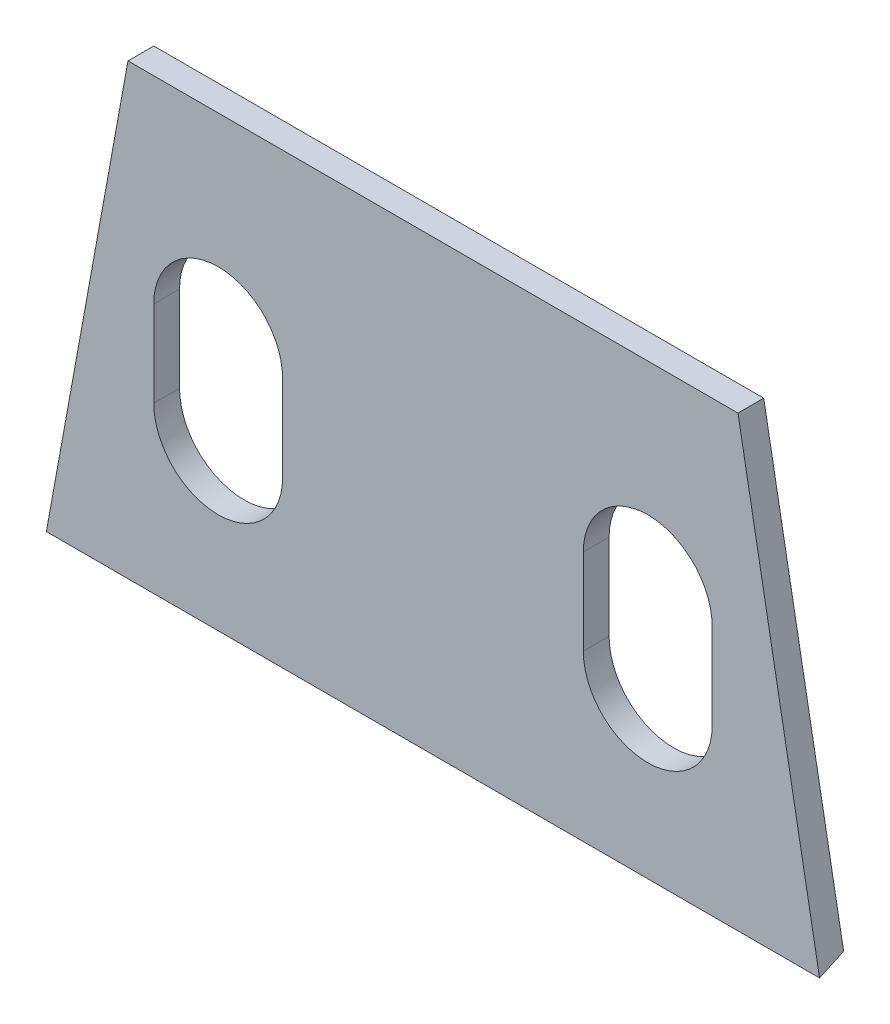
ISO-10303-21;
HEADER;
FILE_DESCRIPTION(('STEP AP214'),'2;1');
FILE_NAME('part.step','',(''),(''),'','','');
FILE_SCHEMA(('AUTOMOTIVE_DESIGN { 1 0 10303 214 1 1 1 1 }'));
ENDSEC;
DATA;
#1=APPLICATION_CONTEXT('core data for automotive mechanical design processes');
#2=APPLICATION_PROTOCOL_DEFINITION('international standard','automotive_design',2000,#1);
#3=PRODUCT_CONTEXT('',#1,'mechanical');
#4=PRODUCT('Part','Part','',(#3));
#5=PRODUCT_RELATED_PRODUCT_CATEGORY('part','',(#4));
#6=PRODUCT_DEFINITION_FORMATION('','',#4);
#7=PRODUCT_DEFINITION_CONTEXT('part definition',#1,'design');
#8=PRODUCT_DEFINITION('design','',#6,#7);
#9=PRODUCT_DEFINITION_SHAPE('','',#8);
#10=(LENGTH_UNIT() NAMED_UNIT(*) SI_UNIT(.MILLI.,.METRE.));
#11=(NAMED_UNIT(*) PLANE_ANGLE_UNIT() SI_UNIT($,.RADIAN.));
#12=(NAMED_UNIT(*) SI_UNIT($,.STERADIAN.) SOLID_ANGLE_UNIT());
#13=UNCERTAINTY_MEASURE_WITH_UNIT(LENGTH_MEASURE(1.E-05),#10,'distance_accuracy_value','');
#14=(GEOMETRIC_REPRESENTATION_CONTEXT(3) GLOBAL_UNCERTAINTY_ASSIGNED_CONTEXT((#13)) GLOBAL_UNIT_ASSIGNED_CONTEXT((#10,
#11,#12)) REPRESENTATION_CONTEXT('',''));
#15=CARTESIAN_POINT('',(0.,0.,0.));
#16=DIRECTION('',(0.,0.,1.));
#17=DIRECTION('',(1.,0.,0.));
#18=AXIS2_PLACEMENT_3D('',#15,#16,#17);
#19=CARTESIAN_POINT('',(35.5,52.2,1.5));
#20=DIRECTION('',(-0.983839740112605,-0.179051293698654,0.));
#21=DIRECTION('',(0.179051293698654,-0.983839740112605,0.));
#22=AXIS2_PLACEMENT_3D('',#19,#20,#21);
#23=PLANE('',#22);
#24=DIRECTION('',(-0.179051293698654,0.983839740112605,0.));
#25=VECTOR('',#24,1.);
#26=CARTESIAN_POINT('',(35.5,52.2,1.5));
#27=LINE('',#26,#25);
#28=CARTESIAN_POINT('',(45.,0.,1.5));
#29=VERTEX_POINT('',#28);
#30=CARTESIAN_POINT('',(35.5,52.2,1.5));
#31=VERTEX_POINT('',#30);
#32=EDGE_CURVE('E243',#29,#31,#27,.T.);
#33=ORIENTED_EDGE('',*,*,#32,.F.);
#34=DIRECTION('',(0.0621248119839871,-0.341359493217276,0.937877499530935));
#35=VECTOR('',#34,1.);
#36=CARTESIAN_POINT('',(44.6526456962359,1.90862049015652,-3.74389169901341));
#37=LINE('',#36,#35);
#38=CARTESIAN_POINT('',(44.8012806192225,1.09191070279862,-1.5));
#39=VERTEX_POINT('',#38);
#40=EDGE_CURVE('E68',#29,#39,#37,.F.);
#41=ORIENTED_EDGE('',*,*,#40,.T.);
#42=DIRECTION('',(-0.179051293698654,0.983839740112605,0.));
#43=VECTOR('',#42,1.);
#44=CARTESIAN_POINT('',(35.5,52.2,-1.5));
#45=LINE('',#44,#43);
#46=CARTESIAN_POINT('',(35.5,52.2,-1.5));
#47=VERTEX_POINT('',#46);
#48=EDGE_CURVE('E190',#39,#47,#45,.T.);
#49=ORIENTED_EDGE('',*,*,#48,.T.);
#50=DIRECTION('',(0.,0.,-1.));
#51=VECTOR('',#50,1.);
#52=CARTESIAN_POINT('',(35.5,52.2,1.5));
#53=LINE('',#52,#51);
#54=EDGE_CURVE('E274',#31,#47,#53,.T.);
#55=ORIENTED_EDGE('',*,*,#54,.F.);
#56=EDGE_LOOP('',(#33,#41,#49,#55));
#57=FACE_BOUND('',#56,.T.);
#58=ADVANCED_FACE('F44',(#57),#23,.F.);
#59=CARTESIAN_POINT('',(-35.5,52.2,1.5));
#60=DIRECTION('',(0.,-1.,0.));
#61=DIRECTION('',(0.,0.,-1.));
#62=AXIS2_PLACEMENT_3D('',#59,#60,#61);
#63=PLANE('',#62);
#64=DIRECTION('',(-1.,0.,0.));
#65=VECTOR('',#64,1.);
#66=CARTESIAN_POINT('',(-35.5,52.2,-1.5));
#67=LINE('',#66,#65);
#68=CARTESIAN_POINT('',(-35.5,52.2,-1.5));
#69=VERTEX_POINT('',#68);
#70=EDGE_CURVE('E266',#47,#69,#67,.T.);
#71=ORIENTED_EDGE('',*,*,#70,.T.);
#72=DIRECTION('',(0.,0.,-1.));
#73=VECTOR('',#72,1.);
#74=CARTESIAN_POINT('',(-35.5,52.2,1.5));
#75=LINE('',#74,#73);
#76=CARTESIAN_POINT('',(-35.5,52.2,1.5));
#77=VERTEX_POINT('',#76);
#78=EDGE_CURVE('E263',#77,#69,#75,.T.);
#79=ORIENTED_EDGE('',*,*,#78,.F.);
#80=DIRECTION('',(-1.,0.,0.));
#81=VECTOR('',#80,1.);
#82=CARTESIAN_POINT('',(-35.5,52.2,1.5));
#83=LINE('',#82,#81);
#84=EDGE_CURVE('E248',#31,#77,#83,.T.);
#85=ORIENTED_EDGE('',*,*,#84,.F.);
#86=ORIENTED_EDGE('',*,*,#54,.T.);
#87=EDGE_LOOP('',(#71,#79,#85,#86));
#88=FACE_BOUND('',#87,.T.);
#89=ADVANCED_FACE('F288',(#88),#63,.F.);
#90=CARTESIAN_POINT('',(-45.,0.,1.5));
#91=DIRECTION('',(0.983839740112605,-0.179051293698654,0.));
#92=DIRECTION('',(0.179051293698654,0.983839740112605,0.));
#93=AXIS2_PLACEMENT_3D('',#90,#91,#92);
#94=PLANE('',#93);
#95=DIRECTION('',(-0.179051293698654,-0.983839740112605,0.));
#96=VECTOR('',#95,1.);
#97=CARTESIAN_POINT('',(-45.,0.,-1.5));
#98=LINE('',#97,#96);
#99=CARTESIAN_POINT('',(-44.8012806192225,1.09191070279861,-1.5));
#100=VERTEX_POINT('',#99);
#101=EDGE_CURVE('E249',#69,#100,#98,.T.);
#102=ORIENTED_EDGE('',*,*,#101,.T.);
#103=DIRECTION('',(0.0621248119839871,0.341359493217276,-0.937877499530935));
#104=VECTOR('',#103,1.);
#105=CARTESIAN_POINT('',(-45.,0.,1.5));
#106=LINE('',#105,#104);
#107=CARTESIAN_POINT('',(-45.,0.,1.5));
#108=VERTEX_POINT('',#107);
#109=EDGE_CURVE('E12',#100,#108,#106,.F.);
#110=ORIENTED_EDGE('',*,*,#109,.T.);
#111=DIRECTION('',(-0.179051293698654,-0.983839740112605,0.));
#112=VECTOR('',#111,1.);
#113=CARTESIAN_POINT('',(-45.,0.,1.5));
#114=LINE('',#113,#112);
#115=EDGE_CURVE('E254',#77,#108,#114,.T.);
#116=ORIENTED_EDGE('',*,*,#115,.F.);
#117=ORIENTED_EDGE('',*,*,#78,.T.);
#118=EDGE_LOOP('',(#102,#110,#116,#117));
#119=FACE_BOUND('',#118,.T.);
#120=ADVANCED_FACE('F291',(#119),#94,.F.);
#121=CARTESIAN_POINT('',(0.,0.,1.5));
#122=DIRECTION('',(0.,0.,1.));
#123=DIRECTION('',(1.,0.,0.));
#124=AXIS2_PLACEMENT_3D('',#121,#122,#123);
#125=PLANE('',#124);
#126=CARTESIAN_POINT('',(-25.,29.2,1.5));
#127=DIRECTION('',(0.,0.,1.));
#128=DIRECTION('',(1.,0.,0.));
#129=AXIS2_PLACEMENT_3D('',#126,#127,#128);
#130=CIRCLE('',#129,7.49999999999997);
#131=CARTESIAN_POINT('',(-17.5,29.2,1.5));
#132=VERTEX_POINT('',#131);
#133=CARTESIAN_POINT('',(-32.5,29.2,1.5));
#134=VERTEX_POINT('',#133);
#135=EDGE_CURVE('E141',#132,#134,#130,.T.);
#136=ORIENTED_EDGE('',*,*,#135,.F.);
#137=DIRECTION('',(0.,1.,0.));
#138=VECTOR('',#137,1.);
#139=CARTESIAN_POINT('',(-17.5,29.2,1.5));
#140=LINE('',#139,#138);
#141=CARTESIAN_POINT('',(-17.5,19.2,1.5));
#142=VERTEX_POINT('',#141);
#143=EDGE_CURVE('E162',#142,#132,#140,.T.);
#144=ORIENTED_EDGE('',*,*,#143,.F.);
#145=CARTESIAN_POINT('',(-25.,19.2,1.5));
#146=DIRECTION('',(0.,0.,1.));
#147=DIRECTION('',(1.,0.,0.));
#148=AXIS2_PLACEMENT_3D('',#145,#146,#147);
#149=CIRCLE('',#148,7.49999999999998);
#150=CARTESIAN_POINT('',(-32.5,19.2,1.5));
#151=VERTEX_POINT('',#150);
#152=EDGE_CURVE('E166',#151,#142,#149,.T.);
#153=ORIENTED_EDGE('',*,*,#152,.F.);
#154=DIRECTION('',(0.,-1.,0.));
#155=VECTOR('',#154,1.);
#156=CARTESIAN_POINT('',(-32.5,29.2,1.5));
#157=LINE('',#156,#155);
#158=EDGE_CURVE('E176',#134,#151,#157,.T.);
#159=ORIENTED_EDGE('',*,*,#158,.F.);
#160=EDGE_LOOP('',(#136,#144,#153,#159));
#161=FACE_BOUND('',#160,.T.);
#162=CARTESIAN_POINT('',(25.,29.2,1.5));
#163=DIRECTION('',(0.,0.,1.));
#164=DIRECTION('',(-1.,0.,0.));
#165=AXIS2_PLACEMENT_3D('',#162,#163,#164);
#166=CIRCLE('',#165,7.49999999999997);
#167=CARTESIAN_POINT('',(32.5,29.2,1.5));
#168=VERTEX_POINT('',#167);
#169=CARTESIAN_POINT('',(17.5,29.2,1.5));
#170=VERTEX_POINT('',#169);
#171=EDGE_CURVE('E214',#168,#170,#166,.T.);
#172=ORIENTED_EDGE('',*,*,#171,.F.);
#173=DIRECTION('',(0.,1.,0.));
#174=VECTOR('',#173,1.);
#175=CARTESIAN_POINT('',(32.5,29.2,1.5));
#176=LINE('',#175,#174);
#177=CARTESIAN_POINT('',(32.5,19.2,1.5));
#178=VERTEX_POINT('',#177);
#179=EDGE_CURVE('E201',#178,#168,#176,.T.);
#180=ORIENTED_EDGE('',*,*,#179,.F.);
#181=CARTESIAN_POINT('',(25.,19.2,1.5));
#182=DIRECTION('',(0.,0.,1.));
#183=DIRECTION('',(-1.,0.,0.));
#184=AXIS2_PLACEMENT_3D('',#181,#182,#183);
#185=CIRCLE('',#184,7.49999999999997);
#186=CARTESIAN_POINT('',(17.5,19.2,1.5));
#187=VERTEX_POINT('',#186);
#188=EDGE_CURVE('E230',#187,#178,#185,.T.);
#189=ORIENTED_EDGE('',*,*,#188,.F.);
#190=DIRECTION('',(0.,-1.,0.));
#191=VECTOR('',#190,1.);
#192=CARTESIAN_POINT('',(17.5,29.2,1.5));
#193=LINE('',#192,#191);
#194=EDGE_CURVE('E218',#170,#187,#193,.T.);
#195=ORIENTED_EDGE('',*,*,#194,.F.);
#196=EDGE_LOOP('',(#172,#180,#189,#195));
#197=FACE_BOUND('',#196,.T.);
#198=ORIENTED_EDGE('',*,*,#32,.T.);
#199=ORIENTED_EDGE('',*,*,#84,.T.);
#200=ORIENTED_EDGE('',*,*,#115,.T.);
#201=DIRECTION('',(1.,0.,0.));
#202=VECTOR('',#201,1.);
#203=CARTESIAN_POINT('',(-45.,0.,1.5));
#204=LINE('',#203,#202);
#205=EDGE_CURVE('E258',#108,#29,#204,.T.);
#206=ORIENTED_EDGE('',*,*,#205,.T.);
#207=EDGE_LOOP('',(#198,#199,#200,#206));
#208=FACE_BOUND('',#207,.T.);
#209=ADVANCED_FACE('F283',(#161,#197,#208),#125,.T.);
#210=CARTESIAN_POINT('',(0.,0.,-1.5));
#211=DIRECTION('',(0.,0.,1.));
#212=DIRECTION('',(1.,0.,0.));
#213=AXIS2_PLACEMENT_3D('',#210,#211,#212);
#214=PLANE('',#213);
#215=DIRECTION('',(0.,1.,0.));
#216=VECTOR('',#215,1.);
#217=CARTESIAN_POINT('',(-17.5,29.2,-1.5));
#218=LINE('',#217,#216);
#219=CARTESIAN_POINT('',(-17.5,19.2,-1.5));
#220=VERTEX_POINT('',#219);
#221=CARTESIAN_POINT('',(-17.5,29.2,-1.5));
#222=VERTEX_POINT('',#221);
#223=EDGE_CURVE('E147',#220,#222,#218,.T.);
#224=ORIENTED_EDGE('',*,*,#223,.T.);
#225=CARTESIAN_POINT('',(-25.,29.2,-1.5));
#226=DIRECTION('',(0.,0.,1.));
#227=DIRECTION('',(1.,0.,0.));
#228=AXIS2_PLACEMENT_3D('',#225,#226,#227);
#229=CIRCLE('',#228,7.49999999999997);
#230=CARTESIAN_POINT('',(-32.5,29.2,-1.5));
#231=VERTEX_POINT('',#230);
#232=EDGE_CURVE('E138',#222,#231,#229,.T.);
#233=ORIENTED_EDGE('',*,*,#232,.T.);
#234=DIRECTION('',(0.,-1.,0.));
#235=VECTOR('',#234,1.);
#236=CARTESIAN_POINT('',(-32.5,29.2,-1.5));
#237=LINE('',#236,#235);
#238=CARTESIAN_POINT('',(-32.5,19.2,-1.5));
#239=VERTEX_POINT('',#238);
#240=EDGE_CURVE('E151',#231,#239,#237,.T.);
#241=ORIENTED_EDGE('',*,*,#240,.T.);
#242=CARTESIAN_POINT('',(-25.,19.2,-1.5));
#243=DIRECTION('',(0.,0.,1.));
#244=DIRECTION('',(1.,0.,0.));
#245=AXIS2_PLACEMENT_3D('',#242,#243,#244);
#246=CIRCLE('',#245,7.49999999999998);
#247=EDGE_CURVE('E156',#239,#220,#246,.T.);
#248=ORIENTED_EDGE('',*,*,#247,.T.);
#249=EDGE_LOOP('',(#224,#233,#241,#248));
#250=FACE_BOUND('',#249,.T.);
#251=DIRECTION('',(0.,1.,0.));
#252=VECTOR('',#251,1.);
#253=CARTESIAN_POINT('',(32.5,29.2,-1.5));
#254=LINE('',#253,#252);
#255=CARTESIAN_POINT('',(32.5,19.2,-1.5));
#256=VERTEX_POINT('',#255);
#257=CARTESIAN_POINT('',(32.5,29.2,-1.5));
#258=VERTEX_POINT('',#257);
#259=EDGE_CURVE('E209',#256,#258,#254,.T.);
#260=ORIENTED_EDGE('',*,*,#259,.T.);
#261=CARTESIAN_POINT('',(25.,29.2,-1.5));
#262=DIRECTION('',(0.,0.,1.));
#263=DIRECTION('',(-1.,0.,0.));
#264=AXIS2_PLACEMENT_3D('',#261,#262,#263);
#265=CIRCLE('',#264,7.49999999999997);
#266=CARTESIAN_POINT('',(17.5,29.2,-1.5));
#267=VERTEX_POINT('',#266);
#268=EDGE_CURVE('E196',#258,#267,#265,.T.);
#269=ORIENTED_EDGE('',*,*,#268,.T.);
#270=DIRECTION('',(0.,-1.,0.));
#271=VECTOR('',#270,1.);
#272=CARTESIAN_POINT('',(17.5,29.2,-1.5));
#273=LINE('',#272,#271);
#274=CARTESIAN_POINT('',(17.5,19.2,-1.5));
#275=VERTEX_POINT('',#274);
#276=EDGE_CURVE('E200',#267,#275,#273,.T.);
#277=ORIENTED_EDGE('',*,*,#276,.T.);
#278=CARTESIAN_POINT('',(25.,19.2,-1.5));
#279=DIRECTION('',(0.,0.,1.));
#280=DIRECTION('',(-1.,0.,0.));
#281=AXIS2_PLACEMENT_3D('',#278,#279,#280);
#282=CIRCLE('',#281,7.49999999999997);
#283=EDGE_CURVE('E205',#275,#256,#282,.T.);
#284=ORIENTED_EDGE('',*,*,#283,.T.);
#285=EDGE_LOOP('',(#260,#269,#277,#284));
#286=FACE_BOUND('',#285,.T.);
#287=ORIENTED_EDGE('',*,*,#48,.F.);
#288=DIRECTION('',(-1.,0.,0.));
#289=VECTOR('',#288,1.);
#290=CARTESIAN_POINT('',(0.,1.09191070279861,-1.5));
#291=LINE('',#290,#289);
#292=EDGE_CURVE('E54',#39,#100,#291,.T.);
#293=ORIENTED_EDGE('',*,*,#292,.T.);
#294=ORIENTED_EDGE('',*,*,#101,.F.);
#295=ORIENTED_EDGE('',*,*,#70,.F.);
#296=EDGE_LOOP('',(#287,#293,#294,#295));
#297=FACE_BOUND('',#296,.T.);
#298=ADVANCED_FACE('F158',(#250,#286,#297),#214,.F.);
#299=CARTESIAN_POINT('',(25.,29.2,-1.5));
#300=DIRECTION('',(0.,0.,1.));
#301=DIRECTION('',(1.,0.,0.));
#302=AXIS2_PLACEMENT_3D('',#299,#300,#301);
#303=CYLINDRICAL_SURFACE('',#302,7.49999999999997);
#304=ORIENTED_EDGE('',*,*,#171,.T.);
#305=DIRECTION('',(0.,0.,1.));
#306=VECTOR('',#305,1.);
#307=CARTESIAN_POINT('',(17.5,29.2,-1.5));
#308=LINE('',#307,#306);
#309=EDGE_CURVE('E213',#267,#170,#308,.T.);
#310=ORIENTED_EDGE('',*,*,#309,.F.);
#311=ORIENTED_EDGE('',*,*,#268,.F.);
#312=DIRECTION('',(0.,0.,1.));
#313=VECTOR('',#312,1.);
#314=CARTESIAN_POINT('',(32.5,29.2,-1.5));
#315=LINE('',#314,#313);
#316=EDGE_CURVE('E177',#258,#168,#315,.T.);
#317=ORIENTED_EDGE('',*,*,#316,.T.);
#318=EDGE_LOOP('',(#304,#310,#311,#317));
#319=FACE_BOUND('',#318,.T.);
#320=ADVANCED_FACE('F295',(#319),#303,.F.);
#321=CARTESIAN_POINT('',(32.5,29.2,-1.5));
#322=DIRECTION('',(1.,0.,0.));
#323=DIRECTION('',(0.,0.,-1.));
#324=AXIS2_PLACEMENT_3D('',#321,#322,#323);
#325=PLANE('',#324);
#326=ORIENTED_EDGE('',*,*,#179,.T.);
#327=ORIENTED_EDGE('',*,*,#316,.F.);
#328=ORIENTED_EDGE('',*,*,#259,.F.);
#329=DIRECTION('',(0.,0.,1.));
#330=VECTOR('',#329,1.);
#331=CARTESIAN_POINT('',(32.5,19.2,-1.5));
#332=LINE('',#331,#330);
#333=EDGE_CURVE('E234',#256,#178,#332,.T.);
#334=ORIENTED_EDGE('',*,*,#333,.T.);
#335=EDGE_LOOP('',(#326,#327,#328,#334));
#336=FACE_BOUND('',#335,.T.);
#337=ADVANCED_FACE('F301',(#336),#325,.F.);
#338=CARTESIAN_POINT('',(25.,19.2,-1.5));
#339=DIRECTION('',(0.,0.,1.));
#340=DIRECTION('',(1.,0.,0.));
#341=AXIS2_PLACEMENT_3D('',#338,#339,#340);
#342=CYLINDRICAL_SURFACE('',#341,7.49999999999997);
#343=ORIENTED_EDGE('',*,*,#188,.T.);
#344=ORIENTED_EDGE('',*,*,#333,.F.);
#345=ORIENTED_EDGE('',*,*,#283,.F.);
#346=DIRECTION('',(0.,0.,1.));
#347=VECTOR('',#346,1.);
#348=CARTESIAN_POINT('',(17.5,19.2,-1.5));
#349=LINE('',#348,#347);
#350=EDGE_CURVE('E237',#275,#187,#349,.T.);
#351=ORIENTED_EDGE('',*,*,#350,.T.);
#352=EDGE_LOOP('',(#343,#344,#345,#351));
#353=FACE_BOUND('',#352,.T.);
#354=ADVANCED_FACE('F370',(#353),#342,.F.);
#355=CARTESIAN_POINT('',(17.5,29.2,-1.5));
#356=DIRECTION('',(-1.,0.,0.));
#357=DIRECTION('',(0.,-1.,0.));
#358=AXIS2_PLACEMENT_3D('',#355,#356,#357);
#359=PLANE('',#358);
#360=ORIENTED_EDGE('',*,*,#194,.T.);
#361=ORIENTED_EDGE('',*,*,#350,.F.);
#362=ORIENTED_EDGE('',*,*,#276,.F.);
#363=ORIENTED_EDGE('',*,*,#309,.T.);
#364=EDGE_LOOP('',(#360,#361,#362,#363));
#365=FACE_BOUND('',#364,.T.);
#366=ADVANCED_FACE('F363',(#365),#359,.F.);
#367=CARTESIAN_POINT('',(-25.,29.2,-1.5));
#368=DIRECTION('',(0.,0.,1.));
#369=DIRECTION('',(1.,0.,0.));
#370=AXIS2_PLACEMENT_3D('',#367,#368,#369);
#371=CYLINDRICAL_SURFACE('',#370,7.49999999999997);
#372=ORIENTED_EDGE('',*,*,#135,.T.);
#373=DIRECTION('',(0.,0.,1.));
#374=VECTOR('',#373,1.);
#375=CARTESIAN_POINT('',(-32.5,29.2,-1.5));
#376=LINE('',#375,#374);
#377=EDGE_CURVE('E134',#231,#134,#376,.T.);
#378=ORIENTED_EDGE('',*,*,#377,.F.);
#379=ORIENTED_EDGE('',*,*,#232,.F.);
#380=DIRECTION('',(0.,0.,1.));
#381=VECTOR('',#380,1.);
#382=CARTESIAN_POINT('',(-17.5,29.2,-1.5));
#383=LINE('',#382,#381);
#384=EDGE_CURVE('E187',#222,#132,#383,.T.);
#385=ORIENTED_EDGE('',*,*,#384,.T.);
#386=EDGE_LOOP('',(#372,#378,#379,#385));
#387=FACE_BOUND('',#386,.T.);
#388=ADVANCED_FACE('F136',(#387),#371,.F.);
#389=CARTESIAN_POINT('',(-17.5,29.2,-1.5));
#390=DIRECTION('',(1.,0.,0.));
#391=DIRECTION('',(0.,1.,0.));
#392=AXIS2_PLACEMENT_3D('',#389,#390,#391);
#393=PLANE('',#392);
#394=ORIENTED_EDGE('',*,*,#143,.T.);
#395=ORIENTED_EDGE('',*,*,#384,.F.);
#396=ORIENTED_EDGE('',*,*,#223,.F.);
#397=DIRECTION('',(0.,0.,1.));
#398=VECTOR('',#397,1.);
#399=CARTESIAN_POINT('',(-17.5,19.2,-1.5));
#400=LINE('',#399,#398);
#401=EDGE_CURVE('E191',#220,#142,#400,.T.);
#402=ORIENTED_EDGE('',*,*,#401,.T.);
#403=EDGE_LOOP('',(#394,#395,#396,#402));
#404=FACE_BOUND('',#403,.T.);
#405=ADVANCED_FACE('F348',(#404),#393,.F.);
#406=CARTESIAN_POINT('',(-25.,19.2,-1.5));
#407=DIRECTION('',(0.,0.,1.));
#408=DIRECTION('',(1.,0.,0.));
#409=AXIS2_PLACEMENT_3D('',#406,#407,#408);
#410=CYLINDRICAL_SURFACE('',#409,7.49999999999998);
#411=ORIENTED_EDGE('',*,*,#152,.T.);
#412=ORIENTED_EDGE('',*,*,#401,.F.);
#413=ORIENTED_EDGE('',*,*,#247,.F.);
#414=DIRECTION('',(0.,0.,1.));
#415=VECTOR('',#414,1.);
#416=CARTESIAN_POINT('',(-32.5,19.2,-1.5));
#417=LINE('',#416,#415);
#418=EDGE_CURVE('E146',#239,#151,#417,.T.);
#419=ORIENTED_EDGE('',*,*,#418,.T.);
#420=EDGE_LOOP('',(#411,#412,#413,#419));
#421=FACE_BOUND('',#420,.T.);
#422=ADVANCED_FACE('F342',(#421),#410,.F.);
#423=CARTESIAN_POINT('',(-32.5,29.2,-1.5));
#424=DIRECTION('',(-1.,0.,0.));
#425=DIRECTION('',(0.,0.,1.));
#426=AXIS2_PLACEMENT_3D('',#423,#424,#425);
#427=PLANE('',#426);
#428=ORIENTED_EDGE('',*,*,#158,.T.);
#429=ORIENTED_EDGE('',*,*,#418,.F.);
#430=ORIENTED_EDGE('',*,*,#240,.F.);
#431=ORIENTED_EDGE('',*,*,#377,.T.);
#432=EDGE_LOOP('',(#428,#429,#430,#431));
#433=FACE_BOUND('',#432,.T.);
#434=ADVANCED_FACE('F152',(#433),#427,.F.);
#435=CARTESIAN_POINT('',(-45.,0.,1.5));
#436=DIRECTION('',(0.,0.939692620785908,0.34202014332567));
#437=DIRECTION('',(1.,0.,0.));
#438=AXIS2_PLACEMENT_3D('',#435,#436,#437);
#439=PLANE('',#438);
#440=ORIENTED_EDGE('',*,*,#109,.F.);
#441=ORIENTED_EDGE('',*,*,#292,.F.);
#442=ORIENTED_EDGE('',*,*,#40,.F.);
#443=ORIENTED_EDGE('',*,*,#205,.F.);
#444=EDGE_LOOP('',(#440,#441,#442,#443));
#445=FACE_BOUND('',#444,.T.);
#446=ADVANCED_FACE('F47',(#445),#439,.F.);
#447=CLOSED_SHELL('',(#58,#89,#120,#209,#298,#320,#337,#354,#366,#388,#405,#422,#434,#446));
#448=MANIFOLD_SOLID_BREP('B2',#447);
#449=ADVANCED_BREP_SHAPE_REPRESENTATION('',(#18,#448),#14);
#450=SHAPE_DEFINITION_REPRESENTATION(#9,#449);
ENDSEC;
END-ISO-10303-21;
